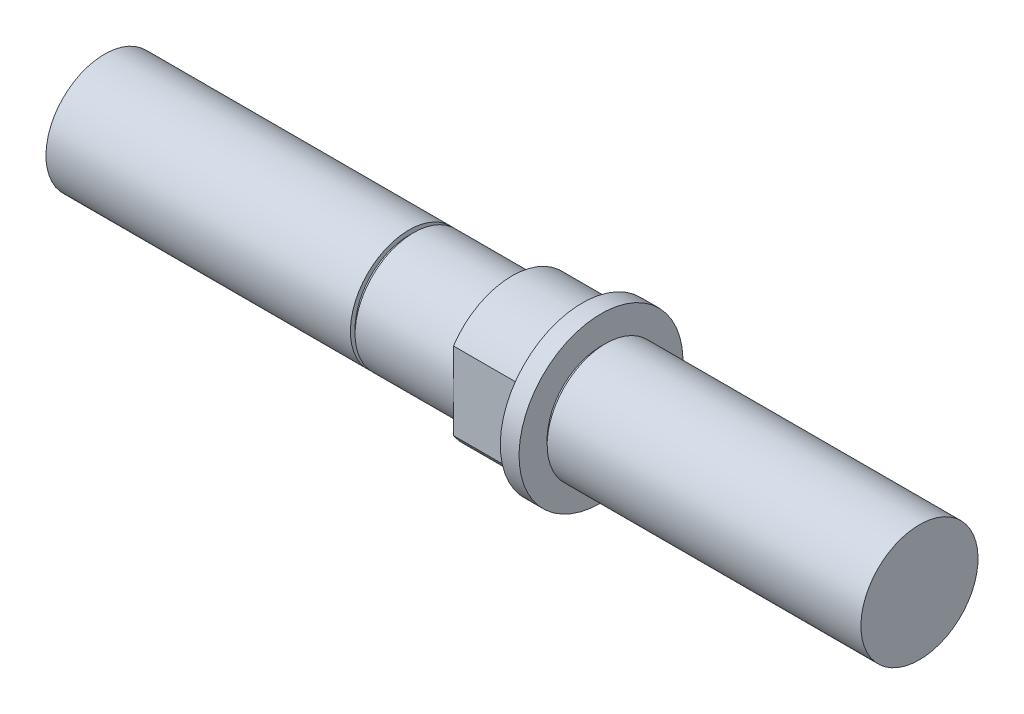
ISO-10303-21;
HEADER;
FILE_DESCRIPTION(('STEP AP214'),'2;1');
FILE_NAME('part.step','',(''),(''),'','','');
FILE_SCHEMA(('AUTOMOTIVE_DESIGN { 1 0 10303 214 1 1 1 1 }'));
ENDSEC;
DATA;
#1=APPLICATION_CONTEXT('core data for automotive mechanical design processes');
#2=APPLICATION_PROTOCOL_DEFINITION('international standard','automotive_design',2000,#1);
#3=PRODUCT_CONTEXT('',#1,'mechanical');
#4=PRODUCT('Part','Part','',(#3));
#5=PRODUCT_RELATED_PRODUCT_CATEGORY('part','',(#4));
#6=PRODUCT_DEFINITION_FORMATION('','',#4);
#7=PRODUCT_DEFINITION_CONTEXT('part definition',#1,'design');
#8=PRODUCT_DEFINITION('design','',#6,#7);
#9=PRODUCT_DEFINITION_SHAPE('','',#8);
#10=(LENGTH_UNIT() NAMED_UNIT(*) SI_UNIT(.MILLI.,.METRE.));
#11=(NAMED_UNIT(*) PLANE_ANGLE_UNIT() SI_UNIT($,.RADIAN.));
#12=(NAMED_UNIT(*) SI_UNIT($,.STERADIAN.) SOLID_ANGLE_UNIT());
#13=UNCERTAINTY_MEASURE_WITH_UNIT(LENGTH_MEASURE(1.E-05),#10,'distance_accuracy_value','');
#14=(GEOMETRIC_REPRESENTATION_CONTEXT(3) GLOBAL_UNCERTAINTY_ASSIGNED_CONTEXT((#13)) GLOBAL_UNIT_ASSIGNED_CONTEXT((#10,
#11,#12)) REPRESENTATION_CONTEXT('',''));
#15=CARTESIAN_POINT('',(0.,0.,0.));
#16=DIRECTION('',(0.,0.,1.));
#17=DIRECTION('',(1.,0.,0.));
#18=AXIS2_PLACEMENT_3D('',#15,#16,#17);
#19=CARTESIAN_POINT('',(-174.,0.,0.));
#20=DIRECTION('',(-1.,0.,0.));
#21=DIRECTION('',(0.,-1.,0.));
#22=AXIS2_PLACEMENT_3D('',#19,#20,#21);
#23=CYLINDRICAL_SURFACE('',#22,15.);
#24=DIRECTION('',(-1.,0.,0.));
#25=VECTOR('',#24,1.);
#26=CARTESIAN_POINT('',(-17.6693753579635,8.29156197588851,12.5));
#27=LINE('',#26,#25);
#28=CARTESIAN_POINT('',(-72.,8.29156197588851,12.5));
#29=VERTEX_POINT('',#28);
#30=CARTESIAN_POINT('',(-87.,8.29156197588851,12.5));
#31=VERTEX_POINT('',#30);
#32=EDGE_CURVE('E103',#29,#31,#27,.T.);
#33=ORIENTED_EDGE('',*,*,#32,.F.);
#34=CARTESIAN_POINT('',(-72.,0.,0.));
#35=DIRECTION('',(-1.,0.,0.));
#36=DIRECTION('',(0.,-1.,0.));
#37=AXIS2_PLACEMENT_3D('',#34,#35,#36);
#38=CIRCLE('',#37,15.);
#39=CARTESIAN_POINT('',(-72.,8.29156197588851,-12.5));
#40=VERTEX_POINT('',#39);
#41=EDGE_CURVE('E96',#29,#40,#38,.T.);
#42=ORIENTED_EDGE('',*,*,#41,.T.);
#43=DIRECTION('',(-1.,0.,0.));
#44=VECTOR('',#43,1.);
#45=CARTESIAN_POINT('',(-17.6693753579635,8.29156197588851,-12.5));
#46=LINE('',#45,#44);
#47=CARTESIAN_POINT('',(-87.,8.29156197588851,-12.5));
#48=VERTEX_POINT('',#47);
#49=EDGE_CURVE('E79',#40,#48,#46,.T.);
#50=ORIENTED_EDGE('',*,*,#49,.T.);
#51=CARTESIAN_POINT('',(-87.,0.,0.));
#52=DIRECTION('',(-1.,0.,0.));
#53=DIRECTION('',(0.,-1.,0.));
#54=AXIS2_PLACEMENT_3D('',#51,#52,#53);
#55=CIRCLE('',#54,15.);
#56=EDGE_CURVE('E108',#31,#48,#55,.T.);
#57=ORIENTED_EDGE('',*,*,#56,.F.);
#58=EDGE_LOOP('',(#33,#42,#50,#57));
#59=FACE_BOUND('',#58,.T.);
#60=ADVANCED_FACE('F34',(#59),#23,.T.);
#61=DIRECTION('',(-1.,0.,0.));
#62=VECTOR('',#61,1.);
#63=CARTESIAN_POINT('',(-17.6693753579635,-8.29156197588851,12.5));
#64=LINE('',#63,#62);
#65=CARTESIAN_POINT('',(-72.,-8.29156197588851,12.5));
#66=VERTEX_POINT('',#65);
#67=CARTESIAN_POINT('',(-87.,-8.29156197588851,12.5));
#68=VERTEX_POINT('',#67);
#69=EDGE_CURVE('E166',#66,#68,#64,.T.);
#70=ORIENTED_EDGE('',*,*,#69,.T.);
#71=CARTESIAN_POINT('',(-87.,-8.29156197588851,-12.5));
#72=VERTEX_POINT('',#71);
#73=EDGE_CURVE('E110',#72,#68,#55,.T.);
#74=ORIENTED_EDGE('',*,*,#73,.F.);
#75=DIRECTION('',(-1.,0.,0.));
#76=VECTOR('',#75,1.);
#77=CARTESIAN_POINT('',(-17.6693753579635,-8.29156197588851,-12.5));
#78=LINE('',#77,#76);
#79=CARTESIAN_POINT('',(-72.,-8.29156197588851,-12.5));
#80=VERTEX_POINT('',#79);
#81=EDGE_CURVE('E89',#80,#72,#78,.T.);
#82=ORIENTED_EDGE('',*,*,#81,.F.);
#83=EDGE_CURVE('E98',#80,#66,#38,.T.);
#84=ORIENTED_EDGE('',*,*,#83,.T.);
#85=EDGE_LOOP('',(#70,#74,#82,#84));
#86=FACE_BOUND('',#85,.T.);
#87=ADVANCED_FACE('F172',(#86),#23,.T.);
#88=CARTESIAN_POINT('',(-87.,15.,0.));
#89=DIRECTION('',(1.,0.,0.));
#90=DIRECTION('',(0.,1.,0.));
#91=AXIS2_PLACEMENT_3D('',#88,#89,#90);
#92=PLANE('',#91);
#93=DIRECTION('',(0.,1.,0.));
#94=VECTOR('',#93,1.);
#95=CARTESIAN_POINT('',(-87.,8.29156197588851,12.5));
#96=LINE('',#95,#94);
#97=CARTESIAN_POINT('',(-87.,0.,12.5));
#98=VERTEX_POINT('',#97);
#99=EDGE_CURVE('E57',#98,#31,#96,.T.);
#100=ORIENTED_EDGE('',*,*,#99,.T.);
#101=ORIENTED_EDGE('',*,*,#56,.T.);
#102=DIRECTION('',(0.,-1.,0.));
#103=VECTOR('',#102,1.);
#104=CARTESIAN_POINT('',(-87.,8.29156197588851,-12.5));
#105=LINE('',#104,#103);
#106=CARTESIAN_POINT('',(-87.,0.,-12.5));
#107=VERTEX_POINT('',#106);
#108=EDGE_CURVE('E84',#48,#107,#105,.T.);
#109=ORIENTED_EDGE('',*,*,#108,.T.);
#110=CARTESIAN_POINT('',(-87.,0.,0.));
#111=DIRECTION('',(-1.,0.,0.));
#112=DIRECTION('',(0.,-1.,0.));
#113=AXIS2_PLACEMENT_3D('',#110,#111,#112);
#114=CIRCLE('',#113,12.5);
#115=EDGE_CURVE('E149',#98,#107,#114,.T.);
#116=ORIENTED_EDGE('',*,*,#115,.F.);
#117=EDGE_LOOP('',(#100,#101,#109,#116));
#118=FACE_BOUND('',#117,.T.);
#119=ADVANCED_FACE('F159',(#118),#92,.F.);
#120=EDGE_CURVE('E163',#68,#98,#96,.T.);
#121=ORIENTED_EDGE('',*,*,#120,.T.);
#122=EDGE_CURVE('E148',#107,#98,#114,.T.);
#123=ORIENTED_EDGE('',*,*,#122,.F.);
#124=EDGE_CURVE('E49',#107,#72,#105,.T.);
#125=ORIENTED_EDGE('',*,*,#124,.T.);
#126=ORIENTED_EDGE('',*,*,#73,.T.);
#127=EDGE_LOOP('',(#121,#123,#125,#126));
#128=FACE_BOUND('',#127,.T.);
#129=ADVANCED_FACE('F120',(#128),#92,.F.);
#130=CARTESIAN_POINT('',(-68.,12.5,0.));
#131=DIRECTION('',(-1.,0.,0.));
#132=DIRECTION('',(0.,-1.,0.));
#133=AXIS2_PLACEMENT_3D('',#130,#131,#132);
#134=PLANE('',#133);
#135=CARTESIAN_POINT('',(-68.,0.,0.));
#136=DIRECTION('',(-1.,0.,0.));
#137=DIRECTION('',(0.,-1.,0.));
#138=AXIS2_PLACEMENT_3D('',#135,#136,#137);
#139=CIRCLE('',#138,17.5);
#140=CARTESIAN_POINT('',(-68.,-17.5,0.));
#141=VERTEX_POINT('',#140);
#142=EDGE_CURVE('E42',#141,#141,#139,.T.);
#143=ORIENTED_EDGE('',*,*,#142,.F.);
#144=EDGE_LOOP('',(#143));
#145=FACE_BOUND('',#144,.T.);
#146=CARTESIAN_POINT('',(-68.,0.,0.));
#147=DIRECTION('',(1.,0.,0.));
#148=DIRECTION('',(0.,0.,-1.));
#149=AXIS2_PLACEMENT_3D('',#146,#147,#148);
#150=CIRCLE('',#149,11.5);
#151=CARTESIAN_POINT('',(-68.,0.,-11.5));
#152=VERTEX_POINT('',#151);
#153=EDGE_CURVE('E124',#152,#152,#150,.T.);
#154=ORIENTED_EDGE('',*,*,#153,.F.);
#155=EDGE_LOOP('',(#154));
#156=FACE_BOUND('',#155,.T.);
#157=ADVANCED_FACE('F117',(#145,#156),#134,.F.);
#158=CARTESIAN_POINT('',(-174.,0.,0.));
#159=DIRECTION('',(-1.,0.,0.));
#160=DIRECTION('',(0.,-1.,0.));
#161=AXIS2_PLACEMENT_3D('',#158,#159,#160);
#162=CYLINDRICAL_SURFACE('',#161,17.5);
#163=CARTESIAN_POINT('',(-72.,0.,0.));
#164=DIRECTION('',(-1.,0.,0.));
#165=DIRECTION('',(0.,-1.,0.));
#166=AXIS2_PLACEMENT_3D('',#163,#164,#165);
#167=CIRCLE('',#166,17.5);
#168=CARTESIAN_POINT('',(-72.,-17.5,0.));
#169=VERTEX_POINT('',#168);
#170=EDGE_CURVE('E104',#169,#169,#167,.T.);
#171=ORIENTED_EDGE('',*,*,#170,.F.);
#172=EDGE_LOOP('',(#171));
#173=FACE_BOUND('',#172,.T.);
#174=ORIENTED_EDGE('',*,*,#142,.T.);
#175=EDGE_LOOP('',(#174));
#176=FACE_BOUND('',#175,.T.);
#177=ADVANCED_FACE('F115',(#173,#176),#162,.T.);
#178=CARTESIAN_POINT('',(-72.,17.5,0.));
#179=DIRECTION('',(1.,0.,0.));
#180=DIRECTION('',(0.,1.,0.));
#181=AXIS2_PLACEMENT_3D('',#178,#179,#180);
#182=PLANE('',#181);
#183=ORIENTED_EDGE('',*,*,#41,.F.);
#184=DIRECTION('',(0.,1.,0.));
#185=VECTOR('',#184,1.);
#186=CARTESIAN_POINT('',(-72.,8.29156197588851,12.5));
#187=LINE('',#186,#185);
#188=EDGE_CURVE('E100',#66,#29,#187,.T.);
#189=ORIENTED_EDGE('',*,*,#188,.F.);
#190=ORIENTED_EDGE('',*,*,#83,.F.);
#191=DIRECTION('',(0.,-1.,0.));
#192=VECTOR('',#191,1.);
#193=CARTESIAN_POINT('',(-72.,8.29156197588851,-12.5));
#194=LINE('',#193,#192);
#195=EDGE_CURVE('E82',#40,#80,#194,.T.);
#196=ORIENTED_EDGE('',*,*,#195,.F.);
#197=EDGE_LOOP('',(#183,#189,#190,#196));
#198=FACE_BOUND('',#197,.T.);
#199=ORIENTED_EDGE('',*,*,#170,.T.);
#200=EDGE_LOOP('',(#199));
#201=FACE_BOUND('',#200,.T.);
#202=ADVANCED_FACE('F94',(#198,#201),#182,.F.);
#203=CARTESIAN_POINT('',(-174.,0.,0.));
#204=DIRECTION('',(-1.,0.,0.));
#205=DIRECTION('',(0.,-1.,0.));
#206=AXIS2_PLACEMENT_3D('',#203,#204,#205);
#207=CYLINDRICAL_SURFACE('',#206,12.5);
#208=CARTESIAN_POINT('',(-108.,0.,0.));
#209=DIRECTION('',(1.,0.,0.));
#210=DIRECTION('',(0.,0.,-1.));
#211=AXIS2_PLACEMENT_3D('',#208,#209,#210);
#212=CIRCLE('',#211,12.5);
#213=CARTESIAN_POINT('',(-108.,0.,-12.5));
#214=VERTEX_POINT('',#213);
#215=EDGE_CURVE('E133',#214,#214,#212,.T.);
#216=ORIENTED_EDGE('',*,*,#215,.T.);
#217=EDGE_LOOP('',(#216));
#218=FACE_BOUND('',#217,.T.);
#219=ORIENTED_EDGE('',*,*,#115,.T.);
#220=ORIENTED_EDGE('',*,*,#122,.T.);
#221=EDGE_LOOP('',(#219,#220));
#222=FACE_BOUND('',#221,.T.);
#223=ADVANCED_FACE('F156',(#218,#222),#207,.T.);
#224=CARTESIAN_POINT('',(-109.,11.5,0.));
#225=DIRECTION('',(-1.,0.,0.));
#226=DIRECTION('',(0.,0.,1.));
#227=AXIS2_PLACEMENT_3D('',#224,#225,#226);
#228=PLANE('',#227);
#229=CARTESIAN_POINT('',(-109.,0.,0.));
#230=DIRECTION('',(1.,0.,0.));
#231=DIRECTION('',(0.,0.,-1.));
#232=AXIS2_PLACEMENT_3D('',#229,#230,#231);
#233=CIRCLE('',#232,11.5);
#234=CARTESIAN_POINT('',(-109.,0.,-11.5));
#235=VERTEX_POINT('',#234);
#236=EDGE_CURVE('E99',#235,#235,#233,.T.);
#237=ORIENTED_EDGE('',*,*,#236,.F.);
#238=EDGE_LOOP('',(#237));
#239=FACE_BOUND('',#238,.T.);
#240=CARTESIAN_POINT('',(-109.,0.,0.));
#241=DIRECTION('',(1.,0.,0.));
#242=DIRECTION('',(0.,0.,-1.));
#243=AXIS2_PLACEMENT_3D('',#240,#241,#242);
#244=CIRCLE('',#243,12.5);
#245=CARTESIAN_POINT('',(-109.,0.,-12.5));
#246=VERTEX_POINT('',#245);
#247=EDGE_CURVE('E127',#246,#246,#244,.T.);
#248=ORIENTED_EDGE('',*,*,#247,.T.);
#249=EDGE_LOOP('',(#248));
#250=FACE_BOUND('',#249,.T.);
#251=ADVANCED_FACE('F221',(#239,#250),#228,.F.);
#252=CARTESIAN_POINT('',(-108.,12.5,0.));
#253=DIRECTION('',(1.,0.,0.));
#254=DIRECTION('',(0.,0.,-1.));
#255=AXIS2_PLACEMENT_3D('',#252,#253,#254);
#256=PLANE('',#255);
#257=ORIENTED_EDGE('',*,*,#215,.F.);
#258=EDGE_LOOP('',(#257));
#259=FACE_BOUND('',#258,.T.);
#260=CARTESIAN_POINT('',(-108.,0.,0.));
#261=DIRECTION('',(1.,0.,0.));
#262=DIRECTION('',(0.,0.,-1.));
#263=AXIS2_PLACEMENT_3D('',#260,#261,#262);
#264=CIRCLE('',#263,11.5);
#265=CARTESIAN_POINT('',(-108.,0.,-11.5));
#266=VERTEX_POINT('',#265);
#267=EDGE_CURVE('E142',#266,#266,#264,.T.);
#268=ORIENTED_EDGE('',*,*,#267,.T.);
#269=EDGE_LOOP('',(#268));
#270=FACE_BOUND('',#269,.T.);
#271=ADVANCED_FACE('F217',(#259,#270),#256,.F.);
#272=CARTESIAN_POINT('',(0.,0.,0.));
#273=DIRECTION('',(1.,0.,0.));
#274=DIRECTION('',(0.,0.,-1.));
#275=AXIS2_PLACEMENT_3D('',#272,#273,#274);
#276=CYLINDRICAL_SURFACE('',#275,11.5);
#277=ORIENTED_EDGE('',*,*,#267,.F.);
#278=EDGE_LOOP('',(#277));
#279=FACE_BOUND('',#278,.T.);
#280=ORIENTED_EDGE('',*,*,#236,.T.);
#281=EDGE_LOOP('',(#280));
#282=FACE_BOUND('',#281,.T.);
#283=ADVANCED_FACE('F213',(#279,#282),#276,.T.);
#284=CARTESIAN_POINT('',(-174.,12.5,0.));
#285=DIRECTION('',(1.,0.,0.));
#286=DIRECTION('',(0.,1.,0.));
#287=AXIS2_PLACEMENT_3D('',#284,#285,#286);
#288=PLANE('',#287);
#289=CARTESIAN_POINT('',(-174.,0.,0.));
#290=DIRECTION('',(-1.,0.,0.));
#291=DIRECTION('',(0.,-1.,0.));
#292=AXIS2_PLACEMENT_3D('',#289,#290,#291);
#293=CIRCLE('',#292,12.5);
#294=CARTESIAN_POINT('',(-174.,-12.5,0.));
#295=VERTEX_POINT('',#294);
#296=EDGE_CURVE('E139',#295,#295,#293,.T.);
#297=ORIENTED_EDGE('',*,*,#296,.T.);
#298=EDGE_LOOP('',(#297));
#299=FACE_BOUND('',#298,.T.);
#300=ADVANCED_FACE('F216',(#299),#288,.F.);
#301=ORIENTED_EDGE('',*,*,#247,.F.);
#302=EDGE_LOOP('',(#301));
#303=FACE_BOUND('',#302,.T.);
#304=ORIENTED_EDGE('',*,*,#296,.F.);
#305=EDGE_LOOP('',(#304));
#306=FACE_BOUND('',#305,.T.);
#307=ADVANCED_FACE('F203',(#303,#306),#207,.T.);
#308=CARTESIAN_POINT('',(-67.,12.5,0.));
#309=DIRECTION('',(1.,0.,0.));
#310=DIRECTION('',(0.,0.,-1.));
#311=AXIS2_PLACEMENT_3D('',#308,#309,#310);
#312=PLANE('',#311);
#313=CARTESIAN_POINT('',(-67.,0.,0.));
#314=DIRECTION('',(1.,0.,0.));
#315=DIRECTION('',(0.,0.,-1.));
#316=AXIS2_PLACEMENT_3D('',#313,#314,#315);
#317=CIRCLE('',#316,12.5);
#318=CARTESIAN_POINT('',(-67.,0.,-12.5));
#319=VERTEX_POINT('',#318);
#320=EDGE_CURVE('E130',#319,#319,#317,.T.);
#321=ORIENTED_EDGE('',*,*,#320,.F.);
#322=EDGE_LOOP('',(#321));
#323=FACE_BOUND('',#322,.T.);
#324=CARTESIAN_POINT('',(-67.,0.,0.));
#325=DIRECTION('',(1.,0.,0.));
#326=DIRECTION('',(0.,0.,-1.));
#327=AXIS2_PLACEMENT_3D('',#324,#325,#326);
#328=CIRCLE('',#327,11.5);
#329=CARTESIAN_POINT('',(-67.,0.,-11.5));
#330=VERTEX_POINT('',#329);
#331=EDGE_CURVE('E126',#330,#330,#328,.T.);
#332=ORIENTED_EDGE('',*,*,#331,.T.);
#333=EDGE_LOOP('',(#332));
#334=FACE_BOUND('',#333,.T.);
#335=ADVANCED_FACE('F200',(#323,#334),#312,.F.);
#336=CARTESIAN_POINT('',(0.,0.,0.));
#337=DIRECTION('',(1.,0.,0.));
#338=DIRECTION('',(0.,0.,-1.));
#339=AXIS2_PLACEMENT_3D('',#336,#337,#338);
#340=CYLINDRICAL_SURFACE('',#339,11.5);
#341=ORIENTED_EDGE('',*,*,#331,.F.);
#342=EDGE_LOOP('',(#341));
#343=FACE_BOUND('',#342,.T.);
#344=ORIENTED_EDGE('',*,*,#153,.T.);
#345=EDGE_LOOP('',(#344));
#346=FACE_BOUND('',#345,.T.);
#347=ADVANCED_FACE('F194',(#343,#346),#340,.T.);
#348=CARTESIAN_POINT('',(0.,0.,0.));
#349=DIRECTION('',(-1.,0.,0.));
#350=DIRECTION('',(0.,-1.,0.));
#351=AXIS2_PLACEMENT_3D('',#348,#349,#350);
#352=PLANE('',#351);
#353=CARTESIAN_POINT('',(0.,0.,0.));
#354=DIRECTION('',(-1.,0.,0.));
#355=DIRECTION('',(0.,-1.,0.));
#356=AXIS2_PLACEMENT_3D('',#353,#354,#355);
#357=CIRCLE('',#356,12.5);
#358=CARTESIAN_POINT('',(0.,-12.5,0.));
#359=VERTEX_POINT('',#358);
#360=EDGE_CURVE('E12',#359,#359,#357,.T.);
#361=ORIENTED_EDGE('',*,*,#360,.F.);
#362=EDGE_LOOP('',(#361));
#363=FACE_BOUND('',#362,.T.);
#364=ADVANCED_FACE('F36',(#363),#352,.F.);
#365=CARTESIAN_POINT('',(-174.,0.,0.));
#366=DIRECTION('',(-1.,0.,0.));
#367=DIRECTION('',(0.,-1.,0.));
#368=AXIS2_PLACEMENT_3D('',#365,#366,#367);
#369=CYLINDRICAL_SURFACE('',#368,12.5);
#370=ORIENTED_EDGE('',*,*,#320,.T.);
#371=EDGE_LOOP('',(#370));
#372=FACE_BOUND('',#371,.T.);
#373=ORIENTED_EDGE('',*,*,#360,.T.);
#374=EDGE_LOOP('',(#373));
#375=FACE_BOUND('',#374,.T.);
#376=ADVANCED_FACE('F186',(#372,#375),#369,.T.);
#377=CARTESIAN_POINT('',(-17.6693753579635,8.29156197588851,-12.5));
#378=DIRECTION('',(0.,0.,-1.));
#379=DIRECTION('',(-1.,0.,0.));
#380=AXIS2_PLACEMENT_3D('',#377,#378,#379);
#381=PLANE('',#380);
#382=ORIENTED_EDGE('',*,*,#195,.T.);
#383=ORIENTED_EDGE('',*,*,#81,.T.);
#384=ORIENTED_EDGE('',*,*,#124,.F.);
#385=ORIENTED_EDGE('',*,*,#108,.F.);
#386=ORIENTED_EDGE('',*,*,#49,.F.);
#387=EDGE_LOOP('',(#382,#383,#384,#385,#386));
#388=FACE_BOUND('',#387,.T.);
#389=ADVANCED_FACE('F81',(#388),#381,.T.);
#390=CARTESIAN_POINT('',(-17.6693753579635,8.29156197588851,12.5));
#391=DIRECTION('',(0.,0.,1.));
#392=DIRECTION('',(1.,0.,0.));
#393=AXIS2_PLACEMENT_3D('',#390,#391,#392);
#394=PLANE('',#393);
#395=ORIENTED_EDGE('',*,*,#188,.T.);
#396=ORIENTED_EDGE('',*,*,#32,.T.);
#397=ORIENTED_EDGE('',*,*,#99,.F.);
#398=ORIENTED_EDGE('',*,*,#120,.F.);
#399=ORIENTED_EDGE('',*,*,#69,.F.);
#400=EDGE_LOOP('',(#395,#396,#397,#398,#399));
#401=FACE_BOUND('',#400,.T.);
#402=ADVANCED_FACE('F170',(#401),#394,.T.);
#403=CLOSED_SHELL('',(#60,#87,#119,#129,#157,#177,#202,#223,#251,#271,#283,#300,#307,#335,#347,
#364,#376,#389,#402));
#404=MANIFOLD_SOLID_BREP('B2',#403);
#405=ADVANCED_BREP_SHAPE_REPRESENTATION('',(#18,#404),#14);
#406=SHAPE_DEFINITION_REPRESENTATION(#9,#405);
ENDSEC;
END-ISO-10303-21;
